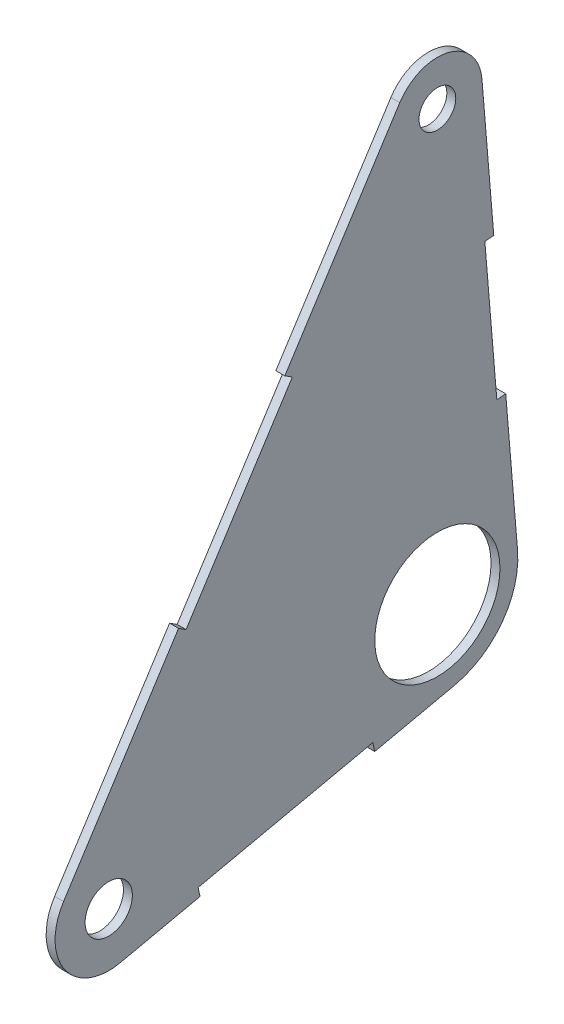
ISO-10303-21;
HEADER;
FILE_DESCRIPTION(('STEP AP214'),'2;1');
FILE_NAME('part.step','',(''),(''),'','','');
FILE_SCHEMA(('AUTOMOTIVE_DESIGN { 1 0 10303 214 1 1 1 1 }'));
ENDSEC;
DATA;
#1=APPLICATION_CONTEXT('core data for automotive mechanical design processes');
#2=APPLICATION_PROTOCOL_DEFINITION('international standard','automotive_design',2000,#1);
#3=PRODUCT_CONTEXT('',#1,'mechanical');
#4=PRODUCT('Part','Part','',(#3));
#5=PRODUCT_RELATED_PRODUCT_CATEGORY('part','',(#4));
#6=PRODUCT_DEFINITION_FORMATION('','',#4);
#7=PRODUCT_DEFINITION_CONTEXT('part definition',#1,'design');
#8=PRODUCT_DEFINITION('design','',#6,#7);
#9=PRODUCT_DEFINITION_SHAPE('','',#8);
#10=(LENGTH_UNIT() NAMED_UNIT(*) SI_UNIT(.MILLI.,.METRE.));
#11=(NAMED_UNIT(*) PLANE_ANGLE_UNIT() SI_UNIT($,.RADIAN.));
#12=(NAMED_UNIT(*) SI_UNIT($,.STERADIAN.) SOLID_ANGLE_UNIT());
#13=UNCERTAINTY_MEASURE_WITH_UNIT(LENGTH_MEASURE(1.E-05),#10,'distance_accuracy_value','');
#14=(GEOMETRIC_REPRESENTATION_CONTEXT(3) GLOBAL_UNCERTAINTY_ASSIGNED_CONTEXT((#13)) GLOBAL_UNIT_ASSIGNED_CONTEXT((#10,
#11,#12)) REPRESENTATION_CONTEXT('',''));
#15=CARTESIAN_POINT('',(0.,0.,0.));
#16=DIRECTION('',(0.,0.,1.));
#17=DIRECTION('',(1.,0.,0.));
#18=AXIS2_PLACEMENT_3D('',#15,#16,#17);
#19=CARTESIAN_POINT('',(1.5875,76.2,0.));
#20=DIRECTION('',(-1.,0.,0.));
#21=DIRECTION('',(0.,0.,1.));
#22=AXIS2_PLACEMENT_3D('',#19,#20,#21);
#23=CYLINDRICAL_SURFACE('',#22,7.93750000000001);
#24=CARTESIAN_POINT('',(0.,76.2,0.));
#25=DIRECTION('',(1.,0.,0.));
#26=DIRECTION('',(0.,0.,-1.));
#27=AXIS2_PLACEMENT_3D('',#24,#25,#26);
#28=CIRCLE('',#27,7.93750000000001);
#29=CARTESIAN_POINT('',(0.,80.4881036193543,6.67952645025685));
#30=VERTEX_POINT('',#29);
#31=CARTESIAN_POINT('',(0.,76.8614583333334,-7.90989122069731));
#32=VERTEX_POINT('',#31);
#33=EDGE_CURVE('E233',#30,#32,#28,.F.);
#34=ORIENTED_EDGE('',*,*,#33,.F.);
#35=DIRECTION('',(-1.,0.,0.));
#36=VECTOR('',#35,1.);
#37=CARTESIAN_POINT('',(1.5875,80.4881036193543,6.67952645025685));
#38=LINE('',#37,#36);
#39=CARTESIAN_POINT('',(1.5875,80.4881036193543,6.67952645025685));
#40=VERTEX_POINT('',#39);
#41=EDGE_CURVE('E11',#40,#30,#38,.T.);
#42=ORIENTED_EDGE('',*,*,#41,.F.);
#43=CARTESIAN_POINT('',(1.5875,76.2,0.));
#44=DIRECTION('',(1.,0.,0.));
#45=DIRECTION('',(0.,0.,-1.));
#46=AXIS2_PLACEMENT_3D('',#43,#44,#45);
#47=CIRCLE('',#46,7.93750000000001);
#48=CARTESIAN_POINT('',(1.5875,76.8614583333334,-7.90989122069731));
#49=VERTEX_POINT('',#48);
#50=EDGE_CURVE('E309',#40,#49,#47,.F.);
#51=ORIENTED_EDGE('',*,*,#50,.T.);
#52=DIRECTION('',(-1.,0.,0.));
#53=VECTOR('',#52,1.);
#54=CARTESIAN_POINT('',(1.5875,76.8614583333334,-7.90989122069731));
#55=LINE('',#54,#53);
#56=EDGE_CURVE('E53',#49,#32,#55,.T.);
#57=ORIENTED_EDGE('',*,*,#56,.T.);
#58=EDGE_LOOP('',(#34,#42,#51,#57));
#59=FACE_BOUND('',#58,.T.);
#60=ADVANCED_FACE('F36',(#59),#23,.T.);
#61=CARTESIAN_POINT('',(1.5875,26.52724610037,41.3211661164517));
#62=DIRECTION('',(0.,0.540233526847779,0.841515143339447));
#63=DIRECTION('',(0.,-0.841515143339447,0.540233526847779));
#64=AXIS2_PLACEMENT_3D('',#61,#62,#63);
#65=PLANE('',#64);
#66=DIRECTION('',(0.,0.841515143339447,-0.540233526847779));
#67=VECTOR('',#66,1.);
#68=CARTESIAN_POINT('',(0.,26.52724610037,41.3211661164517));
#69=LINE('',#68,#67);
#70=CARTESIAN_POINT('',(0.,48.6943581577592,27.0903858131165));
#71=VERTEX_POINT('',#70);
#72=EDGE_CURVE('E230',#71,#30,#69,.T.);
#73=ORIENTED_EDGE('',*,*,#72,.F.);
#74=DIRECTION('',(-1.,0.,0.));
#75=VECTOR('',#74,1.);
#76=CARTESIAN_POINT('',(1.5875,48.6943581577592,27.0903858131165));
#77=LINE('',#76,#75);
#78=CARTESIAN_POINT('',(1.5875,48.6943581577592,27.0903858131165));
#79=VERTEX_POINT('',#78);
#80=EDGE_CURVE('E45',#79,#71,#77,.T.);
#81=ORIENTED_EDGE('',*,*,#80,.F.);
#82=DIRECTION('',(0.,0.841515143339447,-0.540233526847779));
#83=VECTOR('',#82,1.);
#84=CARTESIAN_POINT('',(1.5875,26.52724610037,41.3211661164517));
#85=LINE('',#84,#83);
#86=EDGE_CURVE('E307',#79,#40,#85,.T.);
#87=ORIENTED_EDGE('',*,*,#86,.T.);
#88=ORIENTED_EDGE('',*,*,#41,.T.);
#89=EDGE_LOOP('',(#73,#81,#87,#88));
#90=FACE_BOUND('',#89,.T.);
#91=ADVANCED_FACE('F231',(#90),#65,.T.);
#92=CARTESIAN_POINT('',(1.5875,22.167112057389,-14.2307803033352));
#93=DIRECTION('',(0.,-0.841515143339444,0.540233526847783));
#94=DIRECTION('',(0.,-0.540233526847783,-0.841515143339444));
#95=AXIS2_PLACEMENT_3D('',#92,#93,#94);
#96=PLANE('',#95);
#97=DIRECTION('',(0.,0.540233526847783,0.841515143339444));
#98=VECTOR('',#97,1.);
#99=CARTESIAN_POINT('',(0.,22.167112057389,-14.2307803033352));
#100=LINE('',#99,#98);
#101=CARTESIAN_POINT('',(0.,47.8367374338883,25.754480523065));
#102=VERTEX_POINT('',#101);
#103=EDGE_CURVE('E222',#102,#71,#100,.T.);
#104=ORIENTED_EDGE('',*,*,#103,.F.);
#105=DIRECTION('',(-1.,0.,0.));
#106=VECTOR('',#105,1.);
#107=CARTESIAN_POINT('',(1.5875,47.8367374338883,25.754480523065));
#108=LINE('',#107,#106);
#109=CARTESIAN_POINT('',(1.5875,47.8367374338883,25.754480523065));
#110=VERTEX_POINT('',#109);
#111=EDGE_CURVE('E215',#110,#102,#108,.T.);
#112=ORIENTED_EDGE('',*,*,#111,.F.);
#113=DIRECTION('',(0.,0.540233526847783,0.841515143339444));
#114=VECTOR('',#113,1.);
#115=CARTESIAN_POINT('',(1.5875,22.167112057389,-14.2307803033352));
#116=LINE('',#115,#114);
#117=EDGE_CURVE('E225',#110,#79,#116,.T.);
#118=ORIENTED_EDGE('',*,*,#117,.T.);
#119=ORIENTED_EDGE('',*,*,#80,.T.);
#120=EDGE_LOOP('',(#104,#112,#118,#119));
#121=FACE_BOUND('',#120,.T.);
#122=ADVANCED_FACE('F220',(#121),#96,.T.);
#123=CARTESIAN_POINT('',(1.5875,25.6696253764991,39.9852608264002));
#124=DIRECTION('',(0.,0.540233526847779,0.841515143339447));
#125=DIRECTION('',(0.,-0.841515143339447,0.540233526847779));
#126=AXIS2_PLACEMENT_3D('',#123,#124,#125);
#127=PLANE('',#126);
#128=DIRECTION('',(0.,0.841515143339447,-0.540233526847779));
#129=VECTOR('',#128,1.);
#130=CARTESIAN_POINT('',(0.,25.6696253764991,39.9852608264002));
#131=LINE('',#130,#129);
#132=CARTESIAN_POINT('',(0.,18.4468210527581,44.6221364482237));
#133=VERTEX_POINT('',#132);
#134=EDGE_CURVE('E239',#133,#102,#131,.T.);
#135=ORIENTED_EDGE('',*,*,#134,.F.);
#136=DIRECTION('',(-1.,0.,0.));
#137=VECTOR('',#136,1.);
#138=CARTESIAN_POINT('',(1.5875,18.4468210527581,44.6221364482237));
#139=LINE('',#138,#137);
#140=CARTESIAN_POINT('',(1.5875,18.4468210527581,44.6221364482237));
#141=VERTEX_POINT('',#140);
#142=EDGE_CURVE('E213',#141,#133,#139,.T.);
#143=ORIENTED_EDGE('',*,*,#142,.F.);
#144=DIRECTION('',(0.,0.841515143339447,-0.540233526847779));
#145=VECTOR('',#144,1.);
#146=CARTESIAN_POINT('',(1.5875,25.6696253764991,39.9852608264002));
#147=LINE('',#146,#145);
#148=EDGE_CURVE('E303',#141,#110,#147,.T.);
#149=ORIENTED_EDGE('',*,*,#148,.T.);
#150=ORIENTED_EDGE('',*,*,#111,.T.);
#151=EDGE_LOOP('',(#135,#143,#149,#150));
#152=FACE_BOUND('',#151,.T.);
#153=ADVANCED_FACE('F364',(#152),#127,.T.);
#154=CARTESIAN_POINT('',(1.5875,-7.22280432374097,4.63687562182348));
#155=DIRECTION('',(0.,-0.841515143339447,0.540233526847779));
#156=DIRECTION('',(0.,-0.540233526847779,-0.841515143339447));
#157=AXIS2_PLACEMENT_3D('',#154,#155,#156);
#158=PLANE('',#157);
#159=DIRECTION('',(0.,0.540233526847779,0.841515143339447));
#160=VECTOR('',#159,1.);
#161=CARTESIAN_POINT('',(0.,-7.22280432374097,4.63687562182348));
#162=LINE('',#161,#160);
#163=CARTESIAN_POINT('',(0.,19.304441776629,45.9580417382752));
#164=VERTEX_POINT('',#163);
#165=EDGE_CURVE('E241',#133,#164,#162,.T.);
#166=ORIENTED_EDGE('',*,*,#165,.T.);
#167=DIRECTION('',(-1.,0.,0.));
#168=VECTOR('',#167,1.);
#169=CARTESIAN_POINT('',(1.5875,19.304441776629,45.9580417382752));
#170=LINE('',#169,#168);
#171=CARTESIAN_POINT('',(1.5875,19.304441776629,45.9580417382752));
#172=VERTEX_POINT('',#171);
#173=EDGE_CURVE('E211',#172,#164,#170,.T.);
#174=ORIENTED_EDGE('',*,*,#173,.F.);
#175=DIRECTION('',(0.,0.540233526847779,0.841515143339447));
#176=VECTOR('',#175,1.);
#177=CARTESIAN_POINT('',(1.5875,-7.22280432374097,4.63687562182348));
#178=LINE('',#177,#176);
#179=EDGE_CURVE('E301',#141,#172,#178,.T.);
#180=ORIENTED_EDGE('',*,*,#179,.F.);
#181=ORIENTED_EDGE('',*,*,#142,.T.);
#182=EDGE_LOOP('',(#166,#174,#180,#181));
#183=FACE_BOUND('',#182,.T.);
#184=ADVANCED_FACE('F367',(#183),#158,.F.);
#185=CARTESIAN_POINT('',(0.,-12.4893036849661,66.3689011011348));
#186=VERTEX_POINT('',#185);
#187=EDGE_CURVE('E235',#186,#164,#69,.T.);
#188=ORIENTED_EDGE('',*,*,#187,.F.);
#189=DIRECTION('',(-1.,0.,0.));
#190=VECTOR('',#189,1.);
#191=CARTESIAN_POINT('',(1.5875,-12.4893036849661,66.3689011011348));
#192=LINE('',#191,#190);
#193=CARTESIAN_POINT('',(1.5875,-12.4893036849661,66.3689011011348));
#194=VERTEX_POINT('',#193);
#195=EDGE_CURVE('E209',#194,#186,#192,.T.);
#196=ORIENTED_EDGE('',*,*,#195,.F.);
#197=EDGE_CURVE('E300',#194,#172,#85,.T.);
#198=ORIENTED_EDGE('',*,*,#197,.T.);
#199=ORIENTED_EDGE('',*,*,#173,.T.);
#200=EDGE_LOOP('',(#188,#196,#198,#199));
#201=FACE_BOUND('',#200,.T.);
#202=ADVANCED_FACE('F360',(#201),#65,.T.);
#203=CARTESIAN_POINT('',(1.5875,-17.6350280281911,58.3534693608265));
#204=DIRECTION('',(-1.,0.,0.));
#205=DIRECTION('',(0.,0.,1.));
#206=AXIS2_PLACEMENT_3D('',#203,#204,#205);
#207=CYLINDRICAL_SURFACE('',#206,9.52499999999999);
#208=CARTESIAN_POINT('',(0.,-17.6350280281911,58.3534693608265));
#209=DIRECTION('',(1.,0.,0.));
#210=DIRECTION('',(0.,0.,-1.));
#211=AXIS2_PLACEMENT_3D('',#208,#209,#210);
#212=CIRCLE('',#211,9.52499999999999);
#213=CARTESIAN_POINT('',(0.,-26.9401612637496,56.3187407625843));
#214=VERTEX_POINT('',#213);
#215=EDGE_CURVE('E247',#214,#186,#212,.F.);
#216=ORIENTED_EDGE('',*,*,#215,.F.);
#217=DIRECTION('',(-1.,0.,0.));
#218=VECTOR('',#217,1.);
#219=CARTESIAN_POINT('',(1.5875,-26.9401612637496,56.3187407625843));
#220=LINE('',#219,#218);
#221=CARTESIAN_POINT('',(1.5875,-26.9401612637496,56.3187407625843));
#222=VERTEX_POINT('',#221);
#223=EDGE_CURVE('E207',#222,#214,#220,.T.);
#224=ORIENTED_EDGE('',*,*,#223,.F.);
#225=CARTESIAN_POINT('',(1.5875,-17.6350280281911,58.3534693608265));
#226=DIRECTION('',(1.,0.,0.));
#227=DIRECTION('',(0.,0.,-1.));
#228=AXIS2_PLACEMENT_3D('',#225,#226,#227);
#229=CIRCLE('',#228,9.52499999999999);
#230=EDGE_CURVE('E297',#222,#194,#229,.F.);
#231=ORIENTED_EDGE('',*,*,#230,.T.);
#232=ORIENTED_EDGE('',*,*,#195,.T.);
#233=EDGE_LOOP('',(#216,#224,#231,#232));
#234=FACE_BOUND('',#233,.T.);
#235=ADVANCED_FACE('F373',(#234),#207,.T.);
#236=CARTESIAN_POINT('',(1.5875,-13.9576998533377,-3.05209289736338));
#237=DIRECTION('',(0.,0.97691687512425,0.213619800340394));
#238=DIRECTION('',(0.,-0.213619800340394,0.97691687512425));
#239=AXIS2_PLACEMENT_3D('',#236,#237,#238);
#240=PLANE('',#239);
#241=DIRECTION('',(0.,0.213619800340394,-0.97691687512425));
#242=VECTOR('',#241,1.);
#243=CARTESIAN_POINT('',(0.,-13.9576998533377,-3.05209289736338));
#244=LINE('',#243,#242);
#245=CARTESIAN_POINT('',(0.,-23.8401448889474,42.1418793252079));
#246=VERTEX_POINT('',#245);
#247=EDGE_CURVE('E250',#214,#246,#244,.T.);
#248=ORIENTED_EDGE('',*,*,#247,.T.);
#249=DIRECTION('',(-1.,0.,0.));
#250=VECTOR('',#249,1.);
#251=CARTESIAN_POINT('',(1.5875,-23.8401448889474,42.1418793252079));
#252=LINE('',#251,#250);
#253=CARTESIAN_POINT('',(1.5875,-23.8401448889474,42.1418793252079));
#254=VERTEX_POINT('',#253);
#255=EDGE_CURVE('E204',#254,#246,#252,.T.);
#256=ORIENTED_EDGE('',*,*,#255,.F.);
#257=DIRECTION('',(0.,0.213619800340394,-0.97691687512425));
#258=VECTOR('',#257,1.);
#259=CARTESIAN_POINT('',(1.5875,-13.9576998533377,-3.05209289736338));
#260=LINE('',#259,#258);
#261=EDGE_CURVE('E287',#222,#254,#260,.T.);
#262=ORIENTED_EDGE('',*,*,#261,.F.);
#263=ORIENTED_EDGE('',*,*,#223,.T.);
#264=EDGE_LOOP('',(#248,#256,#262,#263));
#265=FACE_BOUND('',#264,.T.);
#266=ADVANCED_FACE('F377',(#265),#240,.F.);
#267=CARTESIAN_POINT('',(1.5875,-9.8824450356096,45.1939722225713));
#268=DIRECTION('',(0.,-0.213619800340392,0.976916875124251));
#269=DIRECTION('',(0.,-0.976916875124251,-0.213619800340392));
#270=AXIS2_PLACEMENT_3D('',#267,#268,#269);
#271=PLANE('',#270);
#272=DIRECTION('',(0.,0.976916875124251,0.213619800340392));
#273=VECTOR('',#272,1.);
#274=CARTESIAN_POINT('',(0.,-9.8824450356096,45.1939722225713));
#275=LINE('',#274,#273);
#276=CARTESIAN_POINT('',(0.,-22.2892893496877,42.4810007582483));
#277=VERTEX_POINT('',#276);
#278=EDGE_CURVE('E253',#246,#277,#275,.T.);
#279=ORIENTED_EDGE('',*,*,#278,.T.);
#280=DIRECTION('',(-1.,0.,0.));
#281=VECTOR('',#280,1.);
#282=CARTESIAN_POINT('',(1.5875,-22.2892893496877,42.4810007582483));
#283=LINE('',#282,#281);
#284=CARTESIAN_POINT('',(1.5875,-22.2892893496877,42.4810007582483));
#285=VERTEX_POINT('',#284);
#286=EDGE_CURVE('E202',#285,#277,#283,.T.);
#287=ORIENTED_EDGE('',*,*,#286,.F.);
#288=DIRECTION('',(0.,0.976916875124251,0.213619800340392));
#289=VECTOR('',#288,1.);
#290=CARTESIAN_POINT('',(1.5875,-9.8824450356096,45.1939722225713));
#291=LINE('',#290,#289);
#292=EDGE_CURVE('E294',#254,#285,#291,.T.);
#293=ORIENTED_EDGE('',*,*,#292,.F.);
#294=ORIENTED_EDGE('',*,*,#255,.T.);
#295=EDGE_LOOP('',(#279,#287,#293,#294));
#296=FACE_BOUND('',#295,.T.);
#297=ADVANCED_FACE('F379',(#296),#271,.F.);
#298=CARTESIAN_POINT('',(1.5875,-12.406844314078,-2.712971464323));
#299=DIRECTION('',(0.,-0.97691687512425,-0.213619800340394));
#300=DIRECTION('',(0.,0.213619800340394,-0.97691687512425));
#301=AXIS2_PLACEMENT_3D('',#298,#299,#300);
#302=PLANE('',#301);
#303=DIRECTION('',(0.,-0.213619800340394,0.97691687512425));
#304=VECTOR('',#303,1.);
#305=CARTESIAN_POINT('',(0.,-12.406844314078,-2.712971464323));
#306=LINE('',#305,#304);
#307=CARTESIAN_POINT('',(0.,-15.5068606888802,11.4638899730534));
#308=VERTEX_POINT('',#307);
#309=EDGE_CURVE('E257',#308,#277,#306,.T.);
#310=ORIENTED_EDGE('',*,*,#309,.F.);
#311=DIRECTION('',(-1.,0.,0.));
#312=VECTOR('',#311,1.);
#313=CARTESIAN_POINT('',(1.5875,-15.5068606888802,11.4638899730534));
#314=LINE('',#313,#312);
#315=CARTESIAN_POINT('',(1.5875,-15.5068606888802,11.4638899730534));
#316=VERTEX_POINT('',#315);
#317=EDGE_CURVE('E200',#316,#308,#314,.T.);
#318=ORIENTED_EDGE('',*,*,#317,.F.);
#319=DIRECTION('',(0.,-0.213619800340394,0.97691687512425));
#320=VECTOR('',#319,1.);
#321=CARTESIAN_POINT('',(1.5875,-12.406844314078,-2.712971464323));
#322=LINE('',#321,#320);
#323=EDGE_CURVE('E291',#316,#285,#322,.T.);
#324=ORIENTED_EDGE('',*,*,#323,.T.);
#325=ORIENTED_EDGE('',*,*,#286,.T.);
#326=EDGE_LOOP('',(#310,#318,#324,#325));
#327=FACE_BOUND('',#326,.T.);
#328=ADVANCED_FACE('F382',(#327),#302,.T.);
#329=CARTESIAN_POINT('',(1.5875,-3.10001637480221,14.1768614373764));
#330=DIRECTION('',(0.,-0.213619800340395,0.97691687512425));
#331=DIRECTION('',(0.,-0.97691687512425,-0.213619800340395));
#332=AXIS2_PLACEMENT_3D('',#329,#330,#331);
#333=PLANE('',#332);
#334=DIRECTION('',(0.,0.97691687512425,0.213619800340395));
#335=VECTOR('',#334,1.);
#336=CARTESIAN_POINT('',(0.,-3.10001637480221,14.1768614373764));
#337=LINE('',#336,#335);
#338=CARTESIAN_POINT('',(0.,-17.0577162281399,11.124768540013));
#339=VERTEX_POINT('',#338);
#340=EDGE_CURVE('E260',#339,#308,#337,.T.);
#341=ORIENTED_EDGE('',*,*,#340,.F.);
#342=DIRECTION('',(-1.,0.,0.));
#343=VECTOR('',#342,1.);
#344=CARTESIAN_POINT('',(1.5875,-17.0577162281399,11.124768540013));
#345=LINE('',#344,#343);
#346=CARTESIAN_POINT('',(1.5875,-17.0577162281399,11.124768540013));
#347=VERTEX_POINT('',#346);
#348=EDGE_CURVE('E198',#347,#339,#345,.T.);
#349=ORIENTED_EDGE('',*,*,#348,.F.);
#350=DIRECTION('',(0.,0.97691687512425,0.213619800340395));
#351=VECTOR('',#350,1.);
#352=CARTESIAN_POINT('',(1.5875,-3.10001637480221,14.1768614373764));
#353=LINE('',#352,#351);
#354=EDGE_CURVE('E285',#347,#316,#353,.T.);
#355=ORIENTED_EDGE('',*,*,#354,.T.);
#356=ORIENTED_EDGE('',*,*,#317,.T.);
#357=EDGE_LOOP('',(#341,#349,#355,#356));
#358=FACE_BOUND('',#357,.T.);
#359=ADVANCED_FACE('F386',(#358),#333,.T.);
#360=CARTESIAN_POINT('',(0.,-13.9576998533377,-3.05209289736338));
#361=VERTEX_POINT('',#360);
#362=EDGE_CURVE('E254',#339,#361,#244,.T.);
#363=ORIENTED_EDGE('',*,*,#362,.T.);
#364=DIRECTION('',(-1.,0.,0.));
#365=VECTOR('',#364,1.);
#366=CARTESIAN_POINT('',(1.5875,-13.9576998533377,-3.05209289736338));
#367=LINE('',#366,#365);
#368=CARTESIAN_POINT('',(1.5875,-13.9576998533377,-3.05209289736338));
#369=VERTEX_POINT('',#368);
#370=EDGE_CURVE('E195',#369,#361,#367,.T.);
#371=ORIENTED_EDGE('',*,*,#370,.F.);
#372=EDGE_CURVE('E282',#347,#369,#260,.T.);
#373=ORIENTED_EDGE('',*,*,#372,.F.);
#374=ORIENTED_EDGE('',*,*,#348,.T.);
#375=EDGE_LOOP('',(#363,#371,#373,#374));
#376=FACE_BOUND('',#375,.T.);
#377=ADVANCED_FACE('F390',(#376),#240,.F.);
#378=CARTESIAN_POINT('',(1.5875,0.,0.));
#379=DIRECTION('',(-1.,0.,0.));
#380=DIRECTION('',(0.,0.,1.));
#381=AXIS2_PLACEMENT_3D('',#378,#379,#380);
#382=CYLINDRICAL_SURFACE('',#381,14.2875);
#383=CARTESIAN_POINT('',(0.,0.,0.));
#384=DIRECTION('',(1.,0.,0.));
#385=DIRECTION('',(0.,0.,-1.));
#386=AXIS2_PLACEMENT_3D('',#383,#384,#385);
#387=CIRCLE('',#386,14.2875);
#388=CARTESIAN_POINT('',(0.,1.190625,-14.2378041972551));
#389=VERTEX_POINT('',#388);
#390=EDGE_CURVE('E263',#361,#389,#387,.T.);
#391=ORIENTED_EDGE('',*,*,#390,.T.);
#392=DIRECTION('',(-1.,0.,0.));
#393=VECTOR('',#392,1.);
#394=CARTESIAN_POINT('',(1.5875,1.190625,-14.2378041972551));
#395=LINE('',#394,#393);
#396=CARTESIAN_POINT('',(1.5875,1.190625,-14.2378041972551));
#397=VERTEX_POINT('',#396);
#398=EDGE_CURVE('E193',#397,#389,#395,.T.);
#399=ORIENTED_EDGE('',*,*,#398,.F.);
#400=CARTESIAN_POINT('',(1.5875,0.,0.));
#401=DIRECTION('',(1.,0.,0.));
#402=DIRECTION('',(0.,0.,-1.));
#403=AXIS2_PLACEMENT_3D('',#400,#401,#402);
#404=CIRCLE('',#403,14.2875);
#405=EDGE_CURVE('E280',#369,#397,#404,.T.);
#406=ORIENTED_EDGE('',*,*,#405,.F.);
#407=ORIENTED_EDGE('',*,*,#370,.T.);
#408=EDGE_LOOP('',(#391,#399,#406,#407));
#409=FACE_BOUND('',#408,.T.);
#410=ADVANCED_FACE('F354',(#409),#382,.T.);
#411=CARTESIAN_POINT('',(1.5875,1.190625,-14.2378041972551));
#412=DIRECTION('',(0.,0.0833333333333332,-0.996521728591783));
#413=DIRECTION('',(0.,0.996521728591783,0.0833333333333332));
#414=AXIS2_PLACEMENT_3D('',#411,#412,#413);
#415=PLANE('',#414);
#416=DIRECTION('',(0.,-0.996521728591783,-0.0833333333333332));
#417=VECTOR('',#416,1.);
#418=CARTESIAN_POINT('',(0.,1.190625,-14.2378041972551));
#419=LINE('',#418,#417);
#420=CARTESIAN_POINT('',(0.,26.3260416666667,-12.1358750616852));
#421=VERTEX_POINT('',#420);
#422=EDGE_CURVE('E266',#421,#389,#419,.T.);
#423=ORIENTED_EDGE('',*,*,#422,.F.);
#424=DIRECTION('',(-1.,0.,0.));
#425=VECTOR('',#424,1.);
#426=CARTESIAN_POINT('',(1.5875,26.3260416666667,-12.1358750616852));
#427=LINE('',#426,#425);
#428=CARTESIAN_POINT('',(1.5875,26.3260416666667,-12.1358750616852));
#429=VERTEX_POINT('',#428);
#430=EDGE_CURVE('E187',#429,#421,#427,.T.);
#431=ORIENTED_EDGE('',*,*,#430,.F.);
#432=DIRECTION('',(0.,-0.996521728591783,-0.0833333333333332));
#433=VECTOR('',#432,1.);
#434=CARTESIAN_POINT('',(1.5875,1.190625,-14.2378041972551));
#435=LINE('',#434,#433);
#436=EDGE_CURVE('E276',#429,#397,#435,.T.);
#437=ORIENTED_EDGE('',*,*,#436,.T.);
#438=ORIENTED_EDGE('',*,*,#398,.T.);
#439=EDGE_LOOP('',(#423,#431,#437,#438));
#440=FACE_BOUND('',#439,.T.);
#441=ADVANCED_FACE('F347',(#440),#415,.T.);
#442=CARTESIAN_POINT('',(1.5875,25.1354166666669,2.10192913556958));
#443=DIRECTION('',(0.,0.996521728591784,0.0833333333333197));
#444=DIRECTION('',(0.,-0.0833333333333197,0.996521728591784));
#445=AXIS2_PLACEMENT_3D('',#442,#443,#444);
#446=PLANE('',#445);
#447=DIRECTION('',(0.,0.0833333333333197,-0.996521728591784));
#448=VECTOR('',#447,1.);
#449=CARTESIAN_POINT('',(0.,25.1354166666669,2.10192913556958));
#450=LINE('',#449,#448);
#451=CARTESIAN_POINT('',(0.,26.19375,-10.5538968175458));
#452=VERTEX_POINT('',#451);
#453=EDGE_CURVE('E269',#452,#421,#450,.T.);
#454=ORIENTED_EDGE('',*,*,#453,.F.);
#455=DIRECTION('',(-1.,0.,0.));
#456=VECTOR('',#455,1.);
#457=CARTESIAN_POINT('',(1.5875,26.19375,-10.5538968175458));
#458=LINE('',#457,#456);
#459=CARTESIAN_POINT('',(1.5875,26.19375,-10.5538968175458));
#460=VERTEX_POINT('',#459);
#461=EDGE_CURVE('E185',#460,#452,#458,.T.);
#462=ORIENTED_EDGE('',*,*,#461,.F.);
#463=DIRECTION('',(0.,0.0833333333333197,-0.996521728591784));
#464=VECTOR('',#463,1.);
#465=CARTESIAN_POINT('',(1.5875,25.1354166666669,2.10192913556958));
#466=LINE('',#465,#464);
#467=EDGE_CURVE('E179',#460,#429,#466,.T.);
#468=ORIENTED_EDGE('',*,*,#467,.T.);
#469=ORIENTED_EDGE('',*,*,#430,.T.);
#470=EDGE_LOOP('',(#454,#462,#468,#469));
#471=FACE_BOUND('',#470,.T.);
#472=ADVANCED_FACE('F353',(#471),#446,.T.);
#473=CARTESIAN_POINT('',(1.5875,1.05833333333333,-12.6558259531157));
#474=DIRECTION('',(0.,-0.0833333333333331,0.996521728591783));
#475=DIRECTION('',(0.,-0.996521728591783,-0.0833333333333331));
#476=AXIS2_PLACEMENT_3D('',#473,#474,#475);
#477=PLANE('',#476);
#478=DIRECTION('',(0.,0.996521728591783,0.0833333333333331));
#479=VECTOR('',#478,1.);
#480=CARTESIAN_POINT('',(0.,1.05833333333333,-12.6558259531157));
#481=LINE('',#480,#479);
#482=CARTESIAN_POINT('',(0.,51.59375,-8.42984211212774));
#483=VERTEX_POINT('',#482);
#484=EDGE_CURVE('E184',#452,#483,#481,.T.);
#485=ORIENTED_EDGE('',*,*,#484,.T.);
#486=DIRECTION('',(-1.,0.,0.));
#487=VECTOR('',#486,1.);
#488=CARTESIAN_POINT('',(1.5875,51.59375,-8.42984211212774));
#489=LINE('',#488,#487);
#490=CARTESIAN_POINT('',(1.5875,51.59375,-8.42984211212774));
#491=VERTEX_POINT('',#490);
#492=EDGE_CURVE('E167',#491,#483,#489,.T.);
#493=ORIENTED_EDGE('',*,*,#492,.F.);
#494=DIRECTION('',(0.,0.996521728591783,0.0833333333333331));
#495=VECTOR('',#494,1.);
#496=CARTESIAN_POINT('',(1.5875,1.05833333333333,-12.6558259531157));
#497=LINE('',#496,#495);
#498=EDGE_CURVE('E172',#460,#491,#497,.T.);
#499=ORIENTED_EDGE('',*,*,#498,.F.);
#500=ORIENTED_EDGE('',*,*,#461,.T.);
#501=EDGE_LOOP('',(#485,#493,#499,#500));
#502=FACE_BOUND('',#501,.T.);
#503=ADVANCED_FACE('F182',(#502),#477,.F.);
#504=CARTESIAN_POINT('',(1.5875,50.5354166666666,4.22598384098811));
#505=DIRECTION('',(0.,0.996521728591783,0.0833333333333371));
#506=DIRECTION('',(0.,-0.0833333333333371,0.996521728591783));
#507=AXIS2_PLACEMENT_3D('',#504,#505,#506);
#508=PLANE('',#507);
#509=DIRECTION('',(0.,0.0833333333333371,-0.996521728591783));
#510=VECTOR('',#509,1.);
#511=CARTESIAN_POINT('',(0.,50.5354166666666,4.22598384098811));
#512=LINE('',#511,#510);
#513=CARTESIAN_POINT('',(0.,51.7260416666667,-10.0118203562672));
#514=VERTEX_POINT('',#513);
#515=EDGE_CURVE('E274',#483,#514,#512,.T.);
#516=ORIENTED_EDGE('',*,*,#515,.T.);
#517=DIRECTION('',(-1.,0.,0.));
#518=VECTOR('',#517,1.);
#519=CARTESIAN_POINT('',(1.5875,51.7260416666667,-10.0118203562672));
#520=LINE('',#519,#518);
#521=CARTESIAN_POINT('',(1.5875,51.7260416666667,-10.0118203562672));
#522=VERTEX_POINT('',#521);
#523=EDGE_CURVE('E109',#522,#514,#520,.T.);
#524=ORIENTED_EDGE('',*,*,#523,.F.);
#525=DIRECTION('',(0.,0.0833333333333371,-0.996521728591783));
#526=VECTOR('',#525,1.);
#527=CARTESIAN_POINT('',(1.5875,50.5354166666666,4.22598384098811));
#528=LINE('',#527,#526);
#529=EDGE_CURVE('E163',#491,#522,#528,.T.);
#530=ORIENTED_EDGE('',*,*,#529,.F.);
#531=ORIENTED_EDGE('',*,*,#492,.T.);
#532=EDGE_LOOP('',(#516,#524,#530,#531));
#533=FACE_BOUND('',#532,.T.);
#534=ADVANCED_FACE('F165',(#533),#508,.F.);
#535=CARTESIAN_POINT('',(1.5875,0.,0.));
#536=DIRECTION('',(-1.,0.,0.));
#537=DIRECTION('',(0.,0.,1.));
#538=AXIS2_PLACEMENT_3D('',#535,#536,#537);
#539=CYLINDRICAL_SURFACE('',#538,11.1125);
#540=CARTESIAN_POINT('',(1.5875,0.,0.));
#541=DIRECTION('',(1.,0.,0.));
#542=DIRECTION('',(0.,0.,-1.));
#543=AXIS2_PLACEMENT_3D('',#540,#541,#542);
#544=CIRCLE('',#543,11.1125);
#545=CARTESIAN_POINT('',(1.5875,0.,-11.1125));
#546=VERTEX_POINT('',#545);
#547=EDGE_CURVE('E311',#546,#546,#544,.T.);
#548=ORIENTED_EDGE('',*,*,#547,.T.);
#549=EDGE_LOOP('',(#548));
#550=FACE_BOUND('',#549,.T.);
#551=CARTESIAN_POINT('',(0.,0.,0.));
#552=DIRECTION('',(1.,0.,0.));
#553=DIRECTION('',(0.,0.,-1.));
#554=AXIS2_PLACEMENT_3D('',#551,#552,#553);
#555=CIRCLE('',#554,11.1125);
#556=CARTESIAN_POINT('',(0.,0.,-11.1125));
#557=VERTEX_POINT('',#556);
#558=EDGE_CURVE('E317',#557,#557,#555,.T.);
#559=ORIENTED_EDGE('',*,*,#558,.F.);
#560=EDGE_LOOP('',(#559));
#561=FACE_BOUND('',#560,.T.);
#562=ADVANCED_FACE('F38',(#550,#561),#539,.F.);
#563=EDGE_CURVE('E270',#32,#514,#419,.T.);
#564=ORIENTED_EDGE('',*,*,#563,.F.);
#565=ORIENTED_EDGE('',*,*,#56,.F.);
#566=EDGE_CURVE('E171',#49,#522,#435,.T.);
#567=ORIENTED_EDGE('',*,*,#566,.T.);
#568=ORIENTED_EDGE('',*,*,#523,.T.);
#569=EDGE_LOOP('',(#564,#565,#567,#568));
#570=FACE_BOUND('',#569,.T.);
#571=ADVANCED_FACE('F332',(#570),#415,.T.);
#572=CARTESIAN_POINT('',(1.5875,0.,0.));
#573=DIRECTION('',(1.,0.,0.));
#574=DIRECTION('',(0.,0.,-1.));
#575=AXIS2_PLACEMENT_3D('',#572,#573,#574);
#576=PLANE('',#575);
#577=CARTESIAN_POINT('',(1.5875,-17.6350280281911,58.3534693608265));
#578=DIRECTION('',(1.,0.,0.));
#579=DIRECTION('',(0.,0.,-1.));
#580=AXIS2_PLACEMENT_3D('',#577,#578,#579);
#581=CIRCLE('',#580,4.2);
#582=CARTESIAN_POINT('',(1.5875,-17.6350280281911,54.1534693608265));
#583=VERTEX_POINT('',#582);
#584=EDGE_CURVE('E324',#583,#583,#581,.T.);
#585=ORIENTED_EDGE('',*,*,#584,.F.);
#586=EDGE_LOOP('',(#585));
#587=FACE_BOUND('',#586,.T.);
#588=CARTESIAN_POINT('',(1.5875,76.2,0.));
#589=DIRECTION('',(1.,0.,0.));
#590=DIRECTION('',(0.,0.,-1.));
#591=AXIS2_PLACEMENT_3D('',#588,#589,#590);
#592=CIRCLE('',#591,3.26389999999999);
#593=CARTESIAN_POINT('',(1.5875,76.2,-3.26390000000001));
#594=VERTEX_POINT('',#593);
#595=EDGE_CURVE('E318',#594,#594,#592,.T.);
#596=ORIENTED_EDGE('',*,*,#595,.F.);
#597=EDGE_LOOP('',(#596));
#598=FACE_BOUND('',#597,.T.);
#599=ORIENTED_EDGE('',*,*,#547,.F.);
#600=EDGE_LOOP('',(#599));
#601=FACE_BOUND('',#600,.T.);
#602=ORIENTED_EDGE('',*,*,#50,.F.);
#603=ORIENTED_EDGE('',*,*,#86,.F.);
#604=ORIENTED_EDGE('',*,*,#117,.F.);
#605=ORIENTED_EDGE('',*,*,#148,.F.);
#606=ORIENTED_EDGE('',*,*,#179,.T.);
#607=ORIENTED_EDGE('',*,*,#197,.F.);
#608=ORIENTED_EDGE('',*,*,#230,.F.);
#609=ORIENTED_EDGE('',*,*,#261,.T.);
#610=ORIENTED_EDGE('',*,*,#292,.T.);
#611=ORIENTED_EDGE('',*,*,#323,.F.);
#612=ORIENTED_EDGE('',*,*,#354,.F.);
#613=ORIENTED_EDGE('',*,*,#372,.T.);
#614=ORIENTED_EDGE('',*,*,#405,.T.);
#615=ORIENTED_EDGE('',*,*,#436,.F.);
#616=ORIENTED_EDGE('',*,*,#467,.F.);
#617=ORIENTED_EDGE('',*,*,#498,.T.);
#618=ORIENTED_EDGE('',*,*,#529,.T.);
#619=ORIENTED_EDGE('',*,*,#566,.F.);
#620=EDGE_LOOP('',(#602,#603,#604,#605,#606,#607,#608,#609,#610,#611,#612,#613,#614,#615,#616,
#617,#618,#619));
#621=FACE_BOUND('',#620,.T.);
#622=ADVANCED_FACE('F176',(#587,#598,#601,#621),#576,.T.);
#623=CARTESIAN_POINT('',(0.,0.,0.));
#624=DIRECTION('',(1.,0.,0.));
#625=DIRECTION('',(0.,0.,-1.));
#626=AXIS2_PLACEMENT_3D('',#623,#624,#625);
#627=PLANE('',#626);
#628=CARTESIAN_POINT('',(0.,-17.6350280281911,58.3534693608265));
#629=DIRECTION('',(1.,0.,0.));
#630=DIRECTION('',(0.,0.,-1.));
#631=AXIS2_PLACEMENT_3D('',#628,#629,#630);
#632=CIRCLE('',#631,4.2);
#633=CARTESIAN_POINT('',(0.,-17.6350280281911,54.1534693608265));
#634=VERTEX_POINT('',#633);
#635=EDGE_CURVE('E321',#634,#634,#632,.T.);
#636=ORIENTED_EDGE('',*,*,#635,.T.);
#637=EDGE_LOOP('',(#636));
#638=FACE_BOUND('',#637,.T.);
#639=CARTESIAN_POINT('',(0.,76.2,0.));
#640=DIRECTION('',(1.,0.,0.));
#641=DIRECTION('',(0.,0.,-1.));
#642=AXIS2_PLACEMENT_3D('',#639,#640,#641);
#643=CIRCLE('',#642,3.2639);
#644=CARTESIAN_POINT('',(0.,76.2,-3.26390000000003));
#645=VERTEX_POINT('',#644);
#646=EDGE_CURVE('E314',#645,#645,#643,.T.);
#647=ORIENTED_EDGE('',*,*,#646,.T.);
#648=EDGE_LOOP('',(#647));
#649=FACE_BOUND('',#648,.T.);
#650=ORIENTED_EDGE('',*,*,#558,.T.);
#651=EDGE_LOOP('',(#650));
#652=FACE_BOUND('',#651,.T.);
#653=ORIENTED_EDGE('',*,*,#33,.T.);
#654=ORIENTED_EDGE('',*,*,#563,.T.);
#655=ORIENTED_EDGE('',*,*,#515,.F.);
#656=ORIENTED_EDGE('',*,*,#484,.F.);
#657=ORIENTED_EDGE('',*,*,#453,.T.);
#658=ORIENTED_EDGE('',*,*,#422,.T.);
#659=ORIENTED_EDGE('',*,*,#390,.F.);
#660=ORIENTED_EDGE('',*,*,#362,.F.);
#661=ORIENTED_EDGE('',*,*,#340,.T.);
#662=ORIENTED_EDGE('',*,*,#309,.T.);
#663=ORIENTED_EDGE('',*,*,#278,.F.);
#664=ORIENTED_EDGE('',*,*,#247,.F.);
#665=ORIENTED_EDGE('',*,*,#215,.T.);
#666=ORIENTED_EDGE('',*,*,#187,.T.);
#667=ORIENTED_EDGE('',*,*,#165,.F.);
#668=ORIENTED_EDGE('',*,*,#134,.T.);
#669=ORIENTED_EDGE('',*,*,#103,.T.);
#670=ORIENTED_EDGE('',*,*,#72,.T.);
#671=EDGE_LOOP('',(#653,#654,#655,#656,#657,#658,#659,#660,#661,#662,#663,#664,#665,#666,#667,
#668,#669,#670));
#672=FACE_BOUND('',#671,.T.);
#673=ADVANCED_FACE('F236',(#638,#649,#652,#672),#627,.F.);
#674=CARTESIAN_POINT('',(1.5875,76.2,0.));
#675=DIRECTION('',(1.,0.,0.));
#676=DIRECTION('',(0.,0.,-1.));
#677=AXIS2_PLACEMENT_3D('',#674,#675,#676);
#678=CYLINDRICAL_SURFACE('',#677,3.26389999999999);
#679=ORIENTED_EDGE('',*,*,#646,.F.);
#680=EDGE_LOOP('',(#679));
#681=FACE_BOUND('',#680,.T.);
#682=ORIENTED_EDGE('',*,*,#595,.T.);
#683=EDGE_LOOP('',(#682));
#684=FACE_BOUND('',#683,.T.);
#685=ADVANCED_FACE('F421',(#681,#684),#678,.F.);
#686=CARTESIAN_POINT('',(1.5875,-17.6350280281911,58.3534693608265));
#687=DIRECTION('',(1.,0.,0.));
#688=DIRECTION('',(0.,0.,-1.));
#689=AXIS2_PLACEMENT_3D('',#686,#687,#688);
#690=CYLINDRICAL_SURFACE('',#689,4.2);
#691=ORIENTED_EDGE('',*,*,#635,.F.);
#692=EDGE_LOOP('',(#691));
#693=FACE_BOUND('',#692,.T.);
#694=ORIENTED_EDGE('',*,*,#584,.T.);
#695=EDGE_LOOP('',(#694));
#696=FACE_BOUND('',#695,.T.);
#697=ADVANCED_FACE('F328',(#693,#696),#690,.F.);
#698=CLOSED_SHELL('',(#60,#91,#122,#153,#184,#202,#235,#266,#297,#328,#359,#377,#410,#441,#472,
#503,#534,#562,#571,#622,#673,#685,#697));
#699=MANIFOLD_SOLID_BREP('B2',#698);
#700=ADVANCED_BREP_SHAPE_REPRESENTATION('',(#18,#699),#14);
#701=SHAPE_DEFINITION_REPRESENTATION(#9,#700);
ENDSEC;
END-ISO-10303-21;
